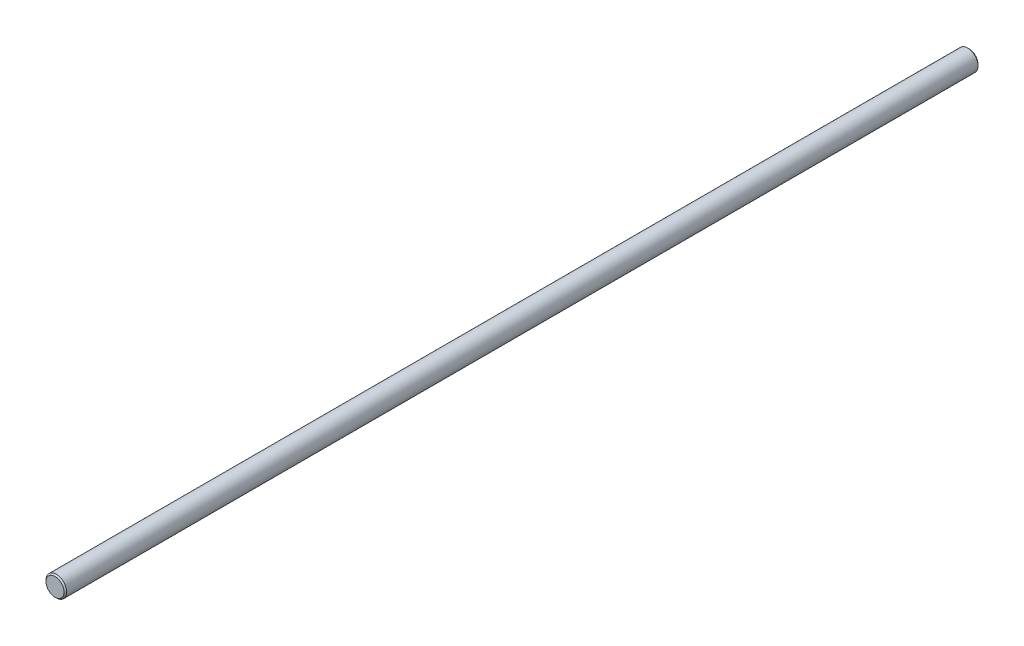
ISO-10303-21;
HEADER;
FILE_DESCRIPTION(('STEP AP214'),'2;1');
FILE_NAME('part.step','',(''),(''),'','','');
FILE_SCHEMA(('AUTOMOTIVE_DESIGN { 1 0 10303 214 1 1 1 1 }'));
ENDSEC;
DATA;
#1=APPLICATION_CONTEXT('core data for automotive mechanical design processes');
#2=APPLICATION_PROTOCOL_DEFINITION('international standard','automotive_design',2000,#1);
#3=PRODUCT_CONTEXT('',#1,'mechanical');
#4=PRODUCT('Part','Part','',(#3));
#5=PRODUCT_RELATED_PRODUCT_CATEGORY('part','',(#4));
#6=PRODUCT_DEFINITION_FORMATION('','',#4);
#7=PRODUCT_DEFINITION_CONTEXT('part definition',#1,'design');
#8=PRODUCT_DEFINITION('design','',#6,#7);
#9=PRODUCT_DEFINITION_SHAPE('','',#8);
#10=(LENGTH_UNIT() NAMED_UNIT(*) SI_UNIT(.MILLI.,.METRE.));
#11=(NAMED_UNIT(*) PLANE_ANGLE_UNIT() SI_UNIT($,.RADIAN.));
#12=(NAMED_UNIT(*) SI_UNIT($,.STERADIAN.) SOLID_ANGLE_UNIT());
#13=UNCERTAINTY_MEASURE_WITH_UNIT(LENGTH_MEASURE(1.E-05),#10,'distance_accuracy_value','');
#14=(GEOMETRIC_REPRESENTATION_CONTEXT(3) GLOBAL_UNCERTAINTY_ASSIGNED_CONTEXT((#13)) GLOBAL_UNIT_ASSIGNED_CONTEXT((#10,
#11,#12)) REPRESENTATION_CONTEXT('',''));
#15=CARTESIAN_POINT('',(0.,0.,0.));
#16=DIRECTION('',(0.,0.,1.));
#17=DIRECTION('',(1.,0.,0.));
#18=AXIS2_PLACEMENT_3D('',#15,#16,#17);
#19=CARTESIAN_POINT('',(0.,0.,354.5));
#20=DIRECTION('',(0.,0.,-1.));
#21=DIRECTION('',(-1.,0.,0.));
#22=AXIS2_PLACEMENT_3D('',#19,#20,#21);
#23=CONICAL_SURFACE('',#22,4.,0.785398163397448);
#24=CARTESIAN_POINT('',(0.,0.,355.));
#25=DIRECTION('',(0.,0.,-1.));
#26=DIRECTION('',(-1.,0.,0.));
#27=AXIS2_PLACEMENT_3D('',#24,#25,#26);
#28=CIRCLE('',#27,3.5);
#29=CARTESIAN_POINT('',(-3.5,0.,355.));
#30=VERTEX_POINT('',#29);
#31=EDGE_CURVE('E42',#30,#30,#28,.T.);
#32=ORIENTED_EDGE('',*,*,#31,.T.);
#33=EDGE_LOOP('',(#32));
#34=FACE_BOUND('',#33,.T.);
#35=CARTESIAN_POINT('',(0.,0.,354.5));
#36=DIRECTION('',(0.,0.,-1.));
#37=DIRECTION('',(-1.,0.,0.));
#38=AXIS2_PLACEMENT_3D('',#35,#36,#37);
#39=CIRCLE('',#38,4.);
#40=CARTESIAN_POINT('',(-4.,0.,354.5));
#41=VERTEX_POINT('',#40);
#42=EDGE_CURVE('E10',#41,#41,#39,.T.);
#43=ORIENTED_EDGE('',*,*,#42,.F.);
#44=EDGE_LOOP('',(#43));
#45=FACE_BOUND('',#44,.T.);
#46=ADVANCED_FACE('F28',(#34,#45),#23,.T.);
#47=CARTESIAN_POINT('',(0.,0.,355.));
#48=DIRECTION('',(0.,0.,-1.));
#49=DIRECTION('',(-1.,0.,0.));
#50=AXIS2_PLACEMENT_3D('',#47,#48,#49);
#51=CYLINDRICAL_SURFACE('',#50,4.);
#52=ORIENTED_EDGE('',*,*,#42,.T.);
#53=EDGE_LOOP('',(#52));
#54=FACE_BOUND('',#53,.T.);
#55=CARTESIAN_POINT('',(0.,0.,0.5));
#56=DIRECTION('',(0.,0.,-1.));
#57=DIRECTION('',(-1.,0.,0.));
#58=AXIS2_PLACEMENT_3D('',#55,#56,#57);
#59=CIRCLE('',#58,4.);
#60=CARTESIAN_POINT('',(-4.,0.,0.5));
#61=VERTEX_POINT('',#60);
#62=EDGE_CURVE('E34',#61,#61,#59,.T.);
#63=ORIENTED_EDGE('',*,*,#62,.F.);
#64=EDGE_LOOP('',(#63));
#65=FACE_BOUND('',#64,.T.);
#66=ADVANCED_FACE('F61',(#54,#65),#51,.T.);
#67=CARTESIAN_POINT('',(0.,0.,0.));
#68=DIRECTION('',(0.,0.,1.));
#69=DIRECTION('',(1.,0.,0.));
#70=AXIS2_PLACEMENT_3D('',#67,#68,#69);
#71=CONICAL_SURFACE('',#70,3.5,0.785398163397448);
#72=ORIENTED_EDGE('',*,*,#62,.T.);
#73=EDGE_LOOP('',(#72));
#74=FACE_BOUND('',#73,.T.);
#75=CARTESIAN_POINT('',(0.,0.,0.));
#76=DIRECTION('',(0.,0.,-1.));
#77=DIRECTION('',(-1.,0.,0.));
#78=AXIS2_PLACEMENT_3D('',#75,#76,#77);
#79=CIRCLE('',#78,3.5);
#80=CARTESIAN_POINT('',(-3.5,0.,0.));
#81=VERTEX_POINT('',#80);
#82=EDGE_CURVE('E38',#81,#81,#79,.T.);
#83=ORIENTED_EDGE('',*,*,#82,.F.);
#84=EDGE_LOOP('',(#83));
#85=FACE_BOUND('',#84,.T.);
#86=ADVANCED_FACE('F57',(#74,#85),#71,.T.);
#87=CARTESIAN_POINT('',(0.,0.,0.));
#88=DIRECTION('',(0.,0.,-1.));
#89=DIRECTION('',(-1.,0.,0.));
#90=AXIS2_PLACEMENT_3D('',#87,#88,#89);
#91=PLANE('',#90);
#92=ORIENTED_EDGE('',*,*,#82,.T.);
#93=EDGE_LOOP('',(#92));
#94=FACE_BOUND('',#93,.T.);
#95=ADVANCED_FACE('F52',(#94),#91,.T.);
#96=CARTESIAN_POINT('',(3.5,0.,355.));
#97=DIRECTION('',(0.,0.,1.));
#98=DIRECTION('',(1.,0.,0.));
#99=AXIS2_PLACEMENT_3D('',#96,#97,#98);
#100=PLANE('',#99);
#101=ORIENTED_EDGE('',*,*,#31,.F.);
#102=EDGE_LOOP('',(#101));
#103=FACE_BOUND('',#102,.T.);
#104=ADVANCED_FACE('F50',(#103),#100,.T.);
#105=CLOSED_SHELL('',(#46,#66,#86,#95,#104));
#106=MANIFOLD_SOLID_BREP('B2',#105);
#107=ADVANCED_BREP_SHAPE_REPRESENTATION('',(#18,#106),#14);
#108=SHAPE_DEFINITION_REPRESENTATION(#9,#107);
ENDSEC;
END-ISO-10303-21;
